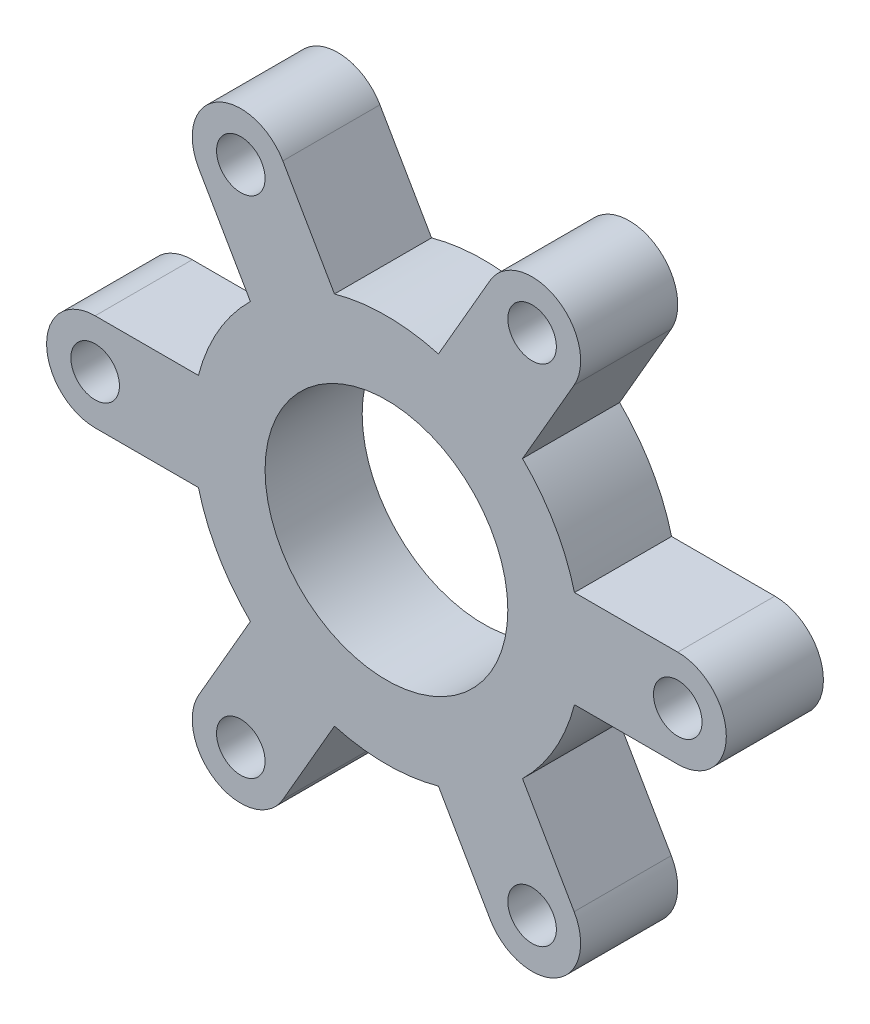
ISO-10303-21;
HEADER;
FILE_DESCRIPTION(('STEP AP214'),'2;1');
FILE_NAME('part.step','',(''),(''),'','','');
FILE_SCHEMA(('AUTOMOTIVE_DESIGN { 1 0 10303 214 1 1 1 1 }'));
ENDSEC;
DATA;
#1=APPLICATION_CONTEXT('core data for automotive mechanical design processes');
#2=APPLICATION_PROTOCOL_DEFINITION('international standard','automotive_design',2000,#1);
#3=PRODUCT_CONTEXT('',#1,'mechanical');
#4=PRODUCT('Part','Part','',(#3));
#5=PRODUCT_RELATED_PRODUCT_CATEGORY('part','',(#4));
#6=PRODUCT_DEFINITION_FORMATION('','',#4);
#7=PRODUCT_DEFINITION_CONTEXT('part definition',#1,'design');
#8=PRODUCT_DEFINITION('design','',#6,#7);
#9=PRODUCT_DEFINITION_SHAPE('','',#8);
#10=(LENGTH_UNIT() NAMED_UNIT(*) SI_UNIT(.MILLI.,.METRE.));
#11=(NAMED_UNIT(*) PLANE_ANGLE_UNIT() SI_UNIT($,.RADIAN.));
#12=(NAMED_UNIT(*) SI_UNIT($,.STERADIAN.) SOLID_ANGLE_UNIT());
#13=UNCERTAINTY_MEASURE_WITH_UNIT(LENGTH_MEASURE(1.E-05),#10,'distance_accuracy_value','');
#14=(GEOMETRIC_REPRESENTATION_CONTEXT(3) GLOBAL_UNCERTAINTY_ASSIGNED_CONTEXT((#13)) GLOBAL_UNIT_ASSIGNED_CONTEXT((#10,
#11,#12)) REPRESENTATION_CONTEXT('',''));
#15=CARTESIAN_POINT('',(0.,0.,0.));
#16=DIRECTION('',(0.,0.,1.));
#17=DIRECTION('',(1.,0.,0.));
#18=AXIS2_PLACEMENT_3D('',#15,#16,#17);
#19=CARTESIAN_POINT('',(-60.,0.,20.));
#20=DIRECTION('',(0.,0.,1.));
#21=DIRECTION('',(1.,0.,0.));
#22=AXIS2_PLACEMENT_3D('',#19,#20,#21);
#23=PLANE('',#22);
#24=CARTESIAN_POINT('',(29.9999999999995,-51.9615242270666,20.));
#25=DIRECTION('',(0.,0.,1.));
#26=DIRECTION('',(1.,0.,0.));
#27=AXIS2_PLACEMENT_3D('',#24,#25,#26);
#28=CIRCLE('',#27,5.);
#29=CARTESIAN_POINT('',(34.9999999999995,-51.9615242270666,20.));
#30=VERTEX_POINT('',#29);
#31=EDGE_CURVE('E540',#30,#30,#28,.T.);
#32=ORIENTED_EDGE('',*,*,#31,.F.);
#33=EDGE_LOOP('',(#32));
#34=FACE_BOUND('',#33,.T.);
#35=CARTESIAN_POINT('',(30.0000000000002,51.9615242270662,20.));
#36=DIRECTION('',(0.,0.,1.));
#37=DIRECTION('',(1.,0.,0.));
#38=AXIS2_PLACEMENT_3D('',#35,#36,#37);
#39=CIRCLE('',#38,5.);
#40=CARTESIAN_POINT('',(35.0000000000002,51.9615242270662,20.));
#41=VERTEX_POINT('',#40);
#42=EDGE_CURVE('E556',#41,#41,#39,.T.);
#43=ORIENTED_EDGE('',*,*,#42,.F.);
#44=EDGE_LOOP('',(#43));
#45=FACE_BOUND('',#44,.T.);
#46=CARTESIAN_POINT('',(-60.,0.,20.));
#47=DIRECTION('',(0.,0.,1.));
#48=DIRECTION('',(1.,0.,0.));
#49=AXIS2_PLACEMENT_3D('',#46,#47,#48);
#50=CIRCLE('',#49,5.);
#51=CARTESIAN_POINT('',(-55.,0.,20.));
#52=VERTEX_POINT('',#51);
#53=EDGE_CURVE('E572',#52,#52,#50,.T.);
#54=ORIENTED_EDGE('',*,*,#53,.F.);
#55=EDGE_LOOP('',(#54));
#56=FACE_BOUND('',#55,.T.);
#57=CARTESIAN_POINT('',(-60.,0.,20.));
#58=DIRECTION('',(0.,0.,1.));
#59=DIRECTION('',(1.,0.,0.));
#60=AXIS2_PLACEMENT_3D('',#57,#58,#59);
#61=CIRCLE('',#60,10.);
#62=CARTESIAN_POINT('',(-60.,10.,20.));
#63=VERTEX_POINT('',#62);
#64=CARTESIAN_POINT('',(-60.,-10.,20.));
#65=VERTEX_POINT('',#64);
#66=EDGE_CURVE('E312',#63,#65,#61,.T.);
#67=ORIENTED_EDGE('',*,*,#66,.T.);
#68=DIRECTION('',(1.,0.,0.));
#69=VECTOR('',#68,1.);
#70=CARTESIAN_POINT('',(-60.,-10.,20.));
#71=LINE('',#70,#69);
#72=CARTESIAN_POINT('',(-38.7298334620742,-9.99999999999999,20.));
#73=VERTEX_POINT('',#72);
#74=EDGE_CURVE('E152',#65,#73,#71,.T.);
#75=ORIENTED_EDGE('',*,*,#74,.T.);
#76=CARTESIAN_POINT('',(0.,0.,20.));
#77=DIRECTION('',(0.,0.,1.));
#78=DIRECTION('',(1.,0.,0.));
#79=AXIS2_PLACEMENT_3D('',#76,#77,#78);
#80=CIRCLE('',#79,40.);
#81=CARTESIAN_POINT('',(-28.0251707688818,-28.5410196624965,20.));
#82=VERTEX_POINT('',#81);
#83=EDGE_CURVE('E397',#73,#82,#80,.T.);
#84=ORIENTED_EDGE('',*,*,#83,.T.);
#85=DIRECTION('',(-0.50000000000001,-0.866025403784433,0.));
#86=VECTOR('',#85,1.);
#87=CARTESIAN_POINT('',(-38.6602540378449,-46.9615242270659,20.));
#88=LINE('',#87,#86);
#89=CARTESIAN_POINT('',(-38.6602540378449,-46.9615242270659,20.));
#90=VERTEX_POINT('',#89);
#91=EDGE_CURVE('E417',#82,#90,#88,.T.);
#92=ORIENTED_EDGE('',*,*,#91,.T.);
#93=CARTESIAN_POINT('',(-30.0000000000006,-51.961524227066,20.));
#94=DIRECTION('',(0.,0.,1.));
#95=DIRECTION('',(1.,0.,0.));
#96=AXIS2_PLACEMENT_3D('',#93,#94,#95);
#97=CIRCLE('',#96,10.);
#98=CARTESIAN_POINT('',(-21.3397459621563,-56.9615242270661,20.));
#99=VERTEX_POINT('',#98);
#100=EDGE_CURVE('E413',#90,#99,#97,.T.);
#101=ORIENTED_EDGE('',*,*,#100,.T.);
#102=DIRECTION('',(0.50000000000001,0.866025403784433,0.));
#103=VECTOR('',#102,1.);
#104=CARTESIAN_POINT('',(-21.3397459621563,-56.9615242270661,20.));
#105=LINE('',#104,#103);
#106=CARTESIAN_POINT('',(-10.7046626931932,-38.5410196624967,20.));
#107=VERTEX_POINT('',#106);
#108=EDGE_CURVE('E416',#99,#107,#105,.T.);
#109=ORIENTED_EDGE('',*,*,#108,.T.);
#110=CARTESIAN_POINT('',(0.,0.,20.));
#111=DIRECTION('',(0.,0.,1.));
#112=DIRECTION('',(1.,0.,0.));
#113=AXIS2_PLACEMENT_3D('',#110,#111,#112);
#114=CIRCLE('',#113,40.);
#115=CARTESIAN_POINT('',(10.7046626931923,-38.5410196624969,20.));
#116=VERTEX_POINT('',#115);
#117=EDGE_CURVE('E421',#107,#116,#114,.T.);
#118=ORIENTED_EDGE('',*,*,#117,.T.);
#119=DIRECTION('',(0.499999999999992,-0.866025403784443,0.));
#120=VECTOR('',#119,1.);
#121=CARTESIAN_POINT('',(21.3397459621551,-56.9615242270665,20.));
#122=LINE('',#121,#120);
#123=CARTESIAN_POINT('',(21.3397459621551,-56.9615242270665,20.));
#124=VERTEX_POINT('',#123);
#125=EDGE_CURVE('E428',#116,#124,#122,.T.);
#126=ORIENTED_EDGE('',*,*,#125,.T.);
#127=CARTESIAN_POINT('',(29.9999999999995,-51.9615242270666,20.));
#128=DIRECTION('',(0.,0.,1.));
#129=DIRECTION('',(1.,0.,0.));
#130=AXIS2_PLACEMENT_3D('',#127,#128,#129);
#131=CIRCLE('',#130,10.);
#132=CARTESIAN_POINT('',(38.6602540378439,-46.9615242270667,20.));
#133=VERTEX_POINT('',#132);
#134=EDGE_CURVE('E431',#124,#133,#131,.T.);
#135=ORIENTED_EDGE('',*,*,#134,.T.);
#136=DIRECTION('',(-0.499999999999992,0.866025403784443,0.));
#137=VECTOR('',#136,1.);
#138=CARTESIAN_POINT('',(38.6602540378439,-46.9615242270667,20.));
#139=LINE('',#138,#137);
#140=CARTESIAN_POINT('',(28.0251707688812,-28.5410196624971,20.));
#141=VERTEX_POINT('',#140);
#142=EDGE_CURVE('E434',#133,#141,#139,.T.);
#143=ORIENTED_EDGE('',*,*,#142,.T.);
#144=CARTESIAN_POINT('',(0.,0.,20.));
#145=DIRECTION('',(0.,0.,1.));
#146=DIRECTION('',(1.,0.,0.));
#147=AXIS2_PLACEMENT_3D('',#144,#145,#146);
#148=CIRCLE('',#147,40.);
#149=CARTESIAN_POINT('',(38.7298334620741,-10.0000000000003,20.));
#150=VERTEX_POINT('',#149);
#151=EDGE_CURVE('E437',#141,#150,#148,.T.);
#152=ORIENTED_EDGE('',*,*,#151,.T.);
#153=DIRECTION('',(1.,0.,0.));
#154=VECTOR('',#153,1.);
#155=CARTESIAN_POINT('',(59.9999999999999,-10.0000000000004,20.));
#156=LINE('',#155,#154);
#157=CARTESIAN_POINT('',(59.9999999999999,-10.0000000000004,20.));
#158=VERTEX_POINT('',#157);
#159=EDGE_CURVE('E440',#150,#158,#156,.T.);
#160=ORIENTED_EDGE('',*,*,#159,.T.);
#161=CARTESIAN_POINT('',(60.,-4.18977760661176E-13,20.));
#162=DIRECTION('',(0.,0.,1.));
#163=DIRECTION('',(1.,0.,0.));
#164=AXIS2_PLACEMENT_3D('',#161,#162,#163);
#165=CIRCLE('',#164,10.);
#166=CARTESIAN_POINT('',(60.0000000000001,9.99999999999958,20.));
#167=VERTEX_POINT('',#166);
#168=EDGE_CURVE('E443',#158,#167,#165,.T.);
#169=ORIENTED_EDGE('',*,*,#168,.T.);
#170=DIRECTION('',(-1.,0.,0.));
#171=VECTOR('',#170,1.);
#172=CARTESIAN_POINT('',(60.0000000000001,9.99999999999958,20.));
#173=LINE('',#172,#171);
#174=CARTESIAN_POINT('',(38.7298334620742,9.99999999999973,20.));
#175=VERTEX_POINT('',#174);
#176=EDGE_CURVE('E446',#167,#175,#173,.T.);
#177=ORIENTED_EDGE('',*,*,#176,.T.);
#178=CARTESIAN_POINT('',(0.,0.,20.));
#179=DIRECTION('',(0.,0.,1.));
#180=DIRECTION('',(1.,0.,0.));
#181=AXIS2_PLACEMENT_3D('',#178,#179,#180);
#182=CIRCLE('',#181,40.);
#183=CARTESIAN_POINT('',(28.0251707688816,28.5410196624967,20.));
#184=VERTEX_POINT('',#183);
#185=EDGE_CURVE('E449',#175,#184,#182,.T.);
#186=ORIENTED_EDGE('',*,*,#185,.T.);
#187=DIRECTION('',(0.500000000000004,0.866025403784436,0.));
#188=VECTOR('',#187,1.);
#189=CARTESIAN_POINT('',(38.6602540378446,46.9615242270661,20.));
#190=LINE('',#189,#188);
#191=CARTESIAN_POINT('',(38.6602540378446,46.9615242270661,20.));
#192=VERTEX_POINT('',#191);
#193=EDGE_CURVE('E452',#184,#192,#190,.T.);
#194=ORIENTED_EDGE('',*,*,#193,.T.);
#195=CARTESIAN_POINT('',(30.0000000000002,51.9615242270662,20.));
#196=DIRECTION('',(0.,0.,1.));
#197=DIRECTION('',(1.,0.,0.));
#198=AXIS2_PLACEMENT_3D('',#195,#196,#197);
#199=CIRCLE('',#198,10.);
#200=CARTESIAN_POINT('',(21.3397459621559,56.9615242270662,20.));
#201=VERTEX_POINT('',#200);
#202=EDGE_CURVE('E455',#192,#201,#199,.T.);
#203=ORIENTED_EDGE('',*,*,#202,.T.);
#204=DIRECTION('',(-0.500000000000004,-0.866025403784436,0.));
#205=VECTOR('',#204,1.);
#206=CARTESIAN_POINT('',(21.3397459621559,56.9615242270662,20.));
#207=LINE('',#206,#205);
#208=CARTESIAN_POINT('',(10.7046626931929,38.5410196624968,20.));
#209=VERTEX_POINT('',#208);
#210=EDGE_CURVE('E458',#201,#209,#207,.T.);
#211=ORIENTED_EDGE('',*,*,#210,.T.);
#212=CARTESIAN_POINT('',(0.,0.,20.));
#213=DIRECTION('',(0.,0.,1.));
#214=DIRECTION('',(1.,0.,0.));
#215=AXIS2_PLACEMENT_3D('',#212,#213,#214);
#216=CIRCLE('',#215,40.);
#217=CARTESIAN_POINT('',(-10.7046626931926,38.5410196624969,20.));
#218=VERTEX_POINT('',#217);
#219=EDGE_CURVE('E461',#209,#218,#216,.T.);
#220=ORIENTED_EDGE('',*,*,#219,.T.);
#221=DIRECTION('',(-0.499999999999998,0.86602540378444,0.));
#222=VECTOR('',#221,1.);
#223=CARTESIAN_POINT('',(-21.3397459621555,56.9615242270664,20.));
#224=LINE('',#223,#222);
#225=CARTESIAN_POINT('',(-21.3397459621555,56.9615242270664,20.));
#226=VERTEX_POINT('',#225);
#227=EDGE_CURVE('E464',#218,#226,#224,.T.);
#228=ORIENTED_EDGE('',*,*,#227,.T.);
#229=CARTESIAN_POINT('',(-29.9999999999999,51.9615242270664,20.));
#230=DIRECTION('',(0.,0.,1.));
#231=DIRECTION('',(1.,0.,0.));
#232=AXIS2_PLACEMENT_3D('',#229,#230,#231);
#233=CIRCLE('',#232,10.);
#234=CARTESIAN_POINT('',(-38.6602540378443,46.9615242270664,20.));
#235=VERTEX_POINT('',#234);
#236=EDGE_CURVE('E219',#226,#235,#233,.T.);
#237=ORIENTED_EDGE('',*,*,#236,.T.);
#238=DIRECTION('',(0.499999999999998,-0.86602540378444,0.));
#239=VECTOR('',#238,1.);
#240=CARTESIAN_POINT('',(-38.6602540378443,46.9615242270664,20.));
#241=LINE('',#240,#239);
#242=CARTESIAN_POINT('',(-28.0251707688814,28.5410196624969,20.));
#243=VERTEX_POINT('',#242);
#244=EDGE_CURVE('E213',#235,#243,#241,.T.);
#245=ORIENTED_EDGE('',*,*,#244,.T.);
#246=CARTESIAN_POINT('',(0.,0.,20.));
#247=DIRECTION('',(0.,0.,1.));
#248=DIRECTION('',(1.,0.,0.));
#249=AXIS2_PLACEMENT_3D('',#246,#247,#248);
#250=CIRCLE('',#249,40.);
#251=CARTESIAN_POINT('',(-38.7298334620742,10.,20.));
#252=VERTEX_POINT('',#251);
#253=EDGE_CURVE('E217',#243,#252,#250,.T.);
#254=ORIENTED_EDGE('',*,*,#253,.T.);
#255=DIRECTION('',(-1.,0.,0.));
#256=VECTOR('',#255,1.);
#257=CARTESIAN_POINT('',(-60.,10.,20.));
#258=LINE('',#257,#256);
#259=EDGE_CURVE('E61',#252,#63,#258,.T.);
#260=ORIENTED_EDGE('',*,*,#259,.T.);
#261=EDGE_LOOP('',(#67,#75,#84,#92,#101,#109,#118,#126,#135,#143,#152,#160,#169,#177,#186,#194,
#203,#211,#220,#228,#237,#245,#254,#260));
#262=FACE_BOUND('',#261,.T.);
#263=CARTESIAN_POINT('',(0.,0.,20.));
#264=DIRECTION('',(0.,0.,1.));
#265=DIRECTION('',(1.,0.,0.));
#266=AXIS2_PLACEMENT_3D('',#263,#264,#265);
#267=CIRCLE('',#266,25.);
#268=CARTESIAN_POINT('',(25.,0.,20.));
#269=VERTEX_POINT('',#268);
#270=EDGE_CURVE('E246',#269,#269,#267,.T.);
#271=ORIENTED_EDGE('',*,*,#270,.F.);
#272=EDGE_LOOP('',(#271));
#273=FACE_BOUND('',#272,.T.);
#274=CARTESIAN_POINT('',(-29.9999999999999,51.9615242270664,20.));
#275=DIRECTION('',(0.,0.,1.));
#276=DIRECTION('',(1.,0.,0.));
#277=AXIS2_PLACEMENT_3D('',#274,#275,#276);
#278=CIRCLE('',#277,5.);
#279=CARTESIAN_POINT('',(-24.9999999999999,51.9615242270664,20.));
#280=VERTEX_POINT('',#279);
#281=EDGE_CURVE('E564',#280,#280,#278,.T.);
#282=ORIENTED_EDGE('',*,*,#281,.F.);
#283=EDGE_LOOP('',(#282));
#284=FACE_BOUND('',#283,.T.);
#285=CARTESIAN_POINT('',(60.,-4.18977760661176E-13,20.));
#286=DIRECTION('',(0.,0.,1.));
#287=DIRECTION('',(1.,0.,0.));
#288=AXIS2_PLACEMENT_3D('',#285,#286,#287);
#289=CIRCLE('',#288,4.99999999999999);
#290=CARTESIAN_POINT('',(65.,-4.18977760661176E-13,20.));
#291=VERTEX_POINT('',#290);
#292=EDGE_CURVE('E548',#291,#291,#289,.T.);
#293=ORIENTED_EDGE('',*,*,#292,.F.);
#294=EDGE_LOOP('',(#293));
#295=FACE_BOUND('',#294,.T.);
#296=CARTESIAN_POINT('',(-30.0000000000006,-51.961524227066,20.));
#297=DIRECTION('',(0.,0.,1.));
#298=DIRECTION('',(1.,0.,0.));
#299=AXIS2_PLACEMENT_3D('',#296,#297,#298);
#300=CIRCLE('',#299,5.);
#301=CARTESIAN_POINT('',(-25.0000000000006,-51.961524227066,20.));
#302=VERTEX_POINT('',#301);
#303=EDGE_CURVE('E529',#302,#302,#300,.T.);
#304=ORIENTED_EDGE('',*,*,#303,.F.);
#305=EDGE_LOOP('',(#304));
#306=FACE_BOUND('',#305,.T.);
#307=ADVANCED_FACE('F43',(#34,#45,#56,#262,#273,#284,#295,#306),#23,.T.);
#308=CARTESIAN_POINT('',(-60.,0.,0.));
#309=DIRECTION('',(0.,0.,1.));
#310=DIRECTION('',(1.,0.,0.));
#311=AXIS2_PLACEMENT_3D('',#308,#309,#310);
#312=PLANE('',#311);
#313=CARTESIAN_POINT('',(-60.,0.,0.));
#314=DIRECTION('',(0.,0.,1.));
#315=DIRECTION('',(1.,0.,0.));
#316=AXIS2_PLACEMENT_3D('',#313,#314,#315);
#317=CIRCLE('',#316,10.);
#318=CARTESIAN_POINT('',(-60.,10.,0.));
#319=VERTEX_POINT('',#318);
#320=CARTESIAN_POINT('',(-60.,-10.,0.));
#321=VERTEX_POINT('',#320);
#322=EDGE_CURVE('E241',#319,#321,#317,.T.);
#323=ORIENTED_EDGE('',*,*,#322,.F.);
#324=DIRECTION('',(-1.,0.,0.));
#325=VECTOR('',#324,1.);
#326=CARTESIAN_POINT('',(-60.,10.,0.));
#327=LINE('',#326,#325);
#328=CARTESIAN_POINT('',(-38.7298334620742,10.,0.));
#329=VERTEX_POINT('',#328);
#330=EDGE_CURVE('E144',#329,#319,#327,.T.);
#331=ORIENTED_EDGE('',*,*,#330,.F.);
#332=CARTESIAN_POINT('',(0.,0.,0.));
#333=DIRECTION('',(0.,0.,1.));
#334=DIRECTION('',(1.,0.,0.));
#335=AXIS2_PLACEMENT_3D('',#332,#333,#334);
#336=CIRCLE('',#335,40.);
#337=CARTESIAN_POINT('',(-28.0251707688814,28.5410196624969,0.));
#338=VERTEX_POINT('',#337);
#339=EDGE_CURVE('E138',#338,#329,#336,.T.);
#340=ORIENTED_EDGE('',*,*,#339,.F.);
#341=DIRECTION('',(0.499999999999998,-0.86602540378444,0.));
#342=VECTOR('',#341,1.);
#343=CARTESIAN_POINT('',(-38.6602540378443,46.9615242270664,0.));
#344=LINE('',#343,#342);
#345=CARTESIAN_POINT('',(-38.6602540378443,46.9615242270664,0.));
#346=VERTEX_POINT('',#345);
#347=EDGE_CURVE('E228',#346,#338,#344,.T.);
#348=ORIENTED_EDGE('',*,*,#347,.F.);
#349=CARTESIAN_POINT('',(-29.9999999999999,51.9615242270664,0.));
#350=DIRECTION('',(0.,0.,1.));
#351=DIRECTION('',(1.,0.,0.));
#352=AXIS2_PLACEMENT_3D('',#349,#350,#351);
#353=CIRCLE('',#352,10.);
#354=CARTESIAN_POINT('',(-21.3397459621555,56.9615242270664,0.));
#355=VERTEX_POINT('',#354);
#356=EDGE_CURVE('E303',#355,#346,#353,.T.);
#357=ORIENTED_EDGE('',*,*,#356,.F.);
#358=DIRECTION('',(-0.499999999999998,0.86602540378444,0.));
#359=VECTOR('',#358,1.);
#360=CARTESIAN_POINT('',(-21.3397459621555,56.9615242270664,0.));
#361=LINE('',#360,#359);
#362=CARTESIAN_POINT('',(-10.7046626931926,38.5410196624969,0.));
#363=VERTEX_POINT('',#362);
#364=EDGE_CURVE('E300',#363,#355,#361,.T.);
#365=ORIENTED_EDGE('',*,*,#364,.F.);
#366=CARTESIAN_POINT('',(0.,0.,0.));
#367=DIRECTION('',(0.,0.,1.));
#368=DIRECTION('',(1.,0.,0.));
#369=AXIS2_PLACEMENT_3D('',#366,#367,#368);
#370=CIRCLE('',#369,40.);
#371=CARTESIAN_POINT('',(10.7046626931929,38.5410196624968,0.));
#372=VERTEX_POINT('',#371);
#373=EDGE_CURVE('E297',#372,#363,#370,.T.);
#374=ORIENTED_EDGE('',*,*,#373,.F.);
#375=DIRECTION('',(-0.500000000000004,-0.866025403784436,0.));
#376=VECTOR('',#375,1.);
#377=CARTESIAN_POINT('',(21.3397459621559,56.9615242270662,0.));
#378=LINE('',#377,#376);
#379=CARTESIAN_POINT('',(21.3397459621559,56.9615242270662,0.));
#380=VERTEX_POINT('',#379);
#381=EDGE_CURVE('E294',#380,#372,#378,.T.);
#382=ORIENTED_EDGE('',*,*,#381,.F.);
#383=CARTESIAN_POINT('',(30.0000000000002,51.9615242270662,0.));
#384=DIRECTION('',(0.,0.,1.));
#385=DIRECTION('',(1.,0.,0.));
#386=AXIS2_PLACEMENT_3D('',#383,#384,#385);
#387=CIRCLE('',#386,10.);
#388=CARTESIAN_POINT('',(38.6602540378446,46.9615242270661,0.));
#389=VERTEX_POINT('',#388);
#390=EDGE_CURVE('E291',#389,#380,#387,.T.);
#391=ORIENTED_EDGE('',*,*,#390,.F.);
#392=DIRECTION('',(0.500000000000004,0.866025403784436,0.));
#393=VECTOR('',#392,1.);
#394=CARTESIAN_POINT('',(38.6602540378446,46.9615242270661,0.));
#395=LINE('',#394,#393);
#396=CARTESIAN_POINT('',(28.0251707688816,28.5410196624967,0.));
#397=VERTEX_POINT('',#396);
#398=EDGE_CURVE('E288',#397,#389,#395,.T.);
#399=ORIENTED_EDGE('',*,*,#398,.F.);
#400=CARTESIAN_POINT('',(0.,0.,0.));
#401=DIRECTION('',(0.,0.,1.));
#402=DIRECTION('',(1.,0.,0.));
#403=AXIS2_PLACEMENT_3D('',#400,#401,#402);
#404=CIRCLE('',#403,40.);
#405=CARTESIAN_POINT('',(38.7298334620742,9.99999999999973,0.));
#406=VERTEX_POINT('',#405);
#407=EDGE_CURVE('E285',#406,#397,#404,.T.);
#408=ORIENTED_EDGE('',*,*,#407,.F.);
#409=DIRECTION('',(-1.,0.,0.));
#410=VECTOR('',#409,1.);
#411=CARTESIAN_POINT('',(60.0000000000001,9.99999999999958,0.));
#412=LINE('',#411,#410);
#413=CARTESIAN_POINT('',(60.0000000000001,9.99999999999958,0.));
#414=VERTEX_POINT('',#413);
#415=EDGE_CURVE('E282',#414,#406,#412,.T.);
#416=ORIENTED_EDGE('',*,*,#415,.F.);
#417=CARTESIAN_POINT('',(60.,-4.18977760661176E-13,0.));
#418=DIRECTION('',(0.,0.,1.));
#419=DIRECTION('',(1.,0.,0.));
#420=AXIS2_PLACEMENT_3D('',#417,#418,#419);
#421=CIRCLE('',#420,10.);
#422=CARTESIAN_POINT('',(59.9999999999999,-10.0000000000004,0.));
#423=VERTEX_POINT('',#422);
#424=EDGE_CURVE('E279',#423,#414,#421,.T.);
#425=ORIENTED_EDGE('',*,*,#424,.F.);
#426=DIRECTION('',(1.,0.,0.));
#427=VECTOR('',#426,1.);
#428=CARTESIAN_POINT('',(59.9999999999999,-10.0000000000004,0.));
#429=LINE('',#428,#427);
#430=CARTESIAN_POINT('',(38.7298334620741,-10.0000000000003,0.));
#431=VERTEX_POINT('',#430);
#432=EDGE_CURVE('E276',#431,#423,#429,.T.);
#433=ORIENTED_EDGE('',*,*,#432,.F.);
#434=CARTESIAN_POINT('',(0.,0.,0.));
#435=DIRECTION('',(0.,0.,1.));
#436=DIRECTION('',(1.,0.,0.));
#437=AXIS2_PLACEMENT_3D('',#434,#435,#436);
#438=CIRCLE('',#437,40.);
#439=CARTESIAN_POINT('',(28.0251707688812,-28.5410196624971,0.));
#440=VERTEX_POINT('',#439);
#441=EDGE_CURVE('E273',#440,#431,#438,.T.);
#442=ORIENTED_EDGE('',*,*,#441,.F.);
#443=DIRECTION('',(-0.499999999999992,0.866025403784443,0.));
#444=VECTOR('',#443,1.);
#445=CARTESIAN_POINT('',(38.6602540378439,-46.9615242270667,0.));
#446=LINE('',#445,#444);
#447=CARTESIAN_POINT('',(38.6602540378439,-46.9615242270667,0.));
#448=VERTEX_POINT('',#447);
#449=EDGE_CURVE('E270',#448,#440,#446,.T.);
#450=ORIENTED_EDGE('',*,*,#449,.F.);
#451=CARTESIAN_POINT('',(29.9999999999995,-51.9615242270666,0.));
#452=DIRECTION('',(0.,0.,1.));
#453=DIRECTION('',(1.,0.,0.));
#454=AXIS2_PLACEMENT_3D('',#451,#452,#453);
#455=CIRCLE('',#454,10.);
#456=CARTESIAN_POINT('',(21.3397459621551,-56.9615242270665,0.));
#457=VERTEX_POINT('',#456);
#458=EDGE_CURVE('E267',#457,#448,#455,.T.);
#459=ORIENTED_EDGE('',*,*,#458,.F.);
#460=DIRECTION('',(0.499999999999992,-0.866025403784443,0.));
#461=VECTOR('',#460,1.);
#462=CARTESIAN_POINT('',(21.3397459621551,-56.9615242270665,0.));
#463=LINE('',#462,#461);
#464=CARTESIAN_POINT('',(10.7046626931923,-38.5410196624969,0.));
#465=VERTEX_POINT('',#464);
#466=EDGE_CURVE('E264',#465,#457,#463,.T.);
#467=ORIENTED_EDGE('',*,*,#466,.F.);
#468=CARTESIAN_POINT('',(0.,0.,0.));
#469=DIRECTION('',(0.,0.,1.));
#470=DIRECTION('',(1.,0.,0.));
#471=AXIS2_PLACEMENT_3D('',#468,#469,#470);
#472=CIRCLE('',#471,40.);
#473=CARTESIAN_POINT('',(-10.7046626931932,-38.5410196624967,0.));
#474=VERTEX_POINT('',#473);
#475=EDGE_CURVE('E261',#474,#465,#472,.T.);
#476=ORIENTED_EDGE('',*,*,#475,.F.);
#477=DIRECTION('',(0.50000000000001,0.866025403784433,0.));
#478=VECTOR('',#477,1.);
#479=CARTESIAN_POINT('',(-21.3397459621563,-56.9615242270661,0.));
#480=LINE('',#479,#478);
#481=CARTESIAN_POINT('',(-21.3397459621563,-56.9615242270661,0.));
#482=VERTEX_POINT('',#481);
#483=EDGE_CURVE('E258',#482,#474,#480,.T.);
#484=ORIENTED_EDGE('',*,*,#483,.F.);
#485=CARTESIAN_POINT('',(-30.0000000000006,-51.961524227066,0.));
#486=DIRECTION('',(0.,0.,1.));
#487=DIRECTION('',(1.,0.,0.));
#488=AXIS2_PLACEMENT_3D('',#485,#486,#487);
#489=CIRCLE('',#488,10.);
#490=CARTESIAN_POINT('',(-38.6602540378449,-46.9615242270659,0.));
#491=VERTEX_POINT('',#490);
#492=EDGE_CURVE('E255',#491,#482,#489,.T.);
#493=ORIENTED_EDGE('',*,*,#492,.F.);
#494=DIRECTION('',(-0.50000000000001,-0.866025403784433,0.));
#495=VECTOR('',#494,1.);
#496=CARTESIAN_POINT('',(-38.6602540378449,-46.9615242270659,0.));
#497=LINE('',#496,#495);
#498=CARTESIAN_POINT('',(-28.0251707688818,-28.5410196624965,0.));
#499=VERTEX_POINT('',#498);
#500=EDGE_CURVE('E252',#499,#491,#497,.T.);
#501=ORIENTED_EDGE('',*,*,#500,.F.);
#502=CARTESIAN_POINT('',(0.,0.,0.));
#503=DIRECTION('',(0.,0.,1.));
#504=DIRECTION('',(1.,0.,0.));
#505=AXIS2_PLACEMENT_3D('',#502,#503,#504);
#506=CIRCLE('',#505,40.);
#507=CARTESIAN_POINT('',(-38.7298334620742,-9.99999999999999,0.));
#508=VERTEX_POINT('',#507);
#509=EDGE_CURVE('E249',#508,#499,#506,.T.);
#510=ORIENTED_EDGE('',*,*,#509,.F.);
#511=DIRECTION('',(1.,0.,0.));
#512=VECTOR('',#511,1.);
#513=CARTESIAN_POINT('',(-60.,-10.,0.));
#514=LINE('',#513,#512);
#515=EDGE_CURVE('E245',#321,#508,#514,.T.);
#516=ORIENTED_EDGE('',*,*,#515,.F.);
#517=EDGE_LOOP('',(#323,#331,#340,#348,#357,#365,#374,#382,#391,#399,#408,#416,#425,#433,#442,
#450,#459,#467,#476,#484,#493,#501,#510,#516));
#518=FACE_BOUND('',#517,.T.);
#519=CARTESIAN_POINT('',(0.,0.,0.));
#520=DIRECTION('',(0.,0.,1.));
#521=DIRECTION('',(1.,0.,0.));
#522=AXIS2_PLACEMENT_3D('',#519,#520,#521);
#523=CIRCLE('',#522,25.);
#524=CARTESIAN_POINT('',(25.,0.,0.));
#525=VERTEX_POINT('',#524);
#526=EDGE_CURVE('E576',#525,#525,#523,.T.);
#527=ORIENTED_EDGE('',*,*,#526,.T.);
#528=EDGE_LOOP('',(#527));
#529=FACE_BOUND('',#528,.T.);
#530=CARTESIAN_POINT('',(-60.,0.,0.));
#531=DIRECTION('',(0.,0.,1.));
#532=DIRECTION('',(1.,0.,0.));
#533=AXIS2_PLACEMENT_3D('',#530,#531,#532);
#534=CIRCLE('',#533,5.);
#535=CARTESIAN_POINT('',(-55.,0.,0.));
#536=VERTEX_POINT('',#535);
#537=EDGE_CURVE('E568',#536,#536,#534,.T.);
#538=ORIENTED_EDGE('',*,*,#537,.T.);
#539=EDGE_LOOP('',(#538));
#540=FACE_BOUND('',#539,.T.);
#541=CARTESIAN_POINT('',(-29.9999999999999,51.9615242270664,0.));
#542=DIRECTION('',(0.,0.,1.));
#543=DIRECTION('',(1.,0.,0.));
#544=AXIS2_PLACEMENT_3D('',#541,#542,#543);
#545=CIRCLE('',#544,5.);
#546=CARTESIAN_POINT('',(-24.9999999999999,51.9615242270664,0.));
#547=VERTEX_POINT('',#546);
#548=EDGE_CURVE('E560',#547,#547,#545,.T.);
#549=ORIENTED_EDGE('',*,*,#548,.T.);
#550=EDGE_LOOP('',(#549));
#551=FACE_BOUND('',#550,.T.);
#552=CARTESIAN_POINT('',(30.0000000000002,51.9615242270662,0.));
#553=DIRECTION('',(0.,0.,1.));
#554=DIRECTION('',(1.,0.,0.));
#555=AXIS2_PLACEMENT_3D('',#552,#553,#554);
#556=CIRCLE('',#555,5.);
#557=CARTESIAN_POINT('',(35.0000000000002,51.9615242270662,0.));
#558=VERTEX_POINT('',#557);
#559=EDGE_CURVE('E552',#558,#558,#556,.T.);
#560=ORIENTED_EDGE('',*,*,#559,.T.);
#561=EDGE_LOOP('',(#560));
#562=FACE_BOUND('',#561,.T.);
#563=CARTESIAN_POINT('',(60.,-4.18977760661176E-13,0.));
#564=DIRECTION('',(0.,0.,1.));
#565=DIRECTION('',(1.,0.,0.));
#566=AXIS2_PLACEMENT_3D('',#563,#564,#565);
#567=CIRCLE('',#566,4.99999999999999);
#568=CARTESIAN_POINT('',(65.,-4.18977760661176E-13,0.));
#569=VERTEX_POINT('',#568);
#570=EDGE_CURVE('E544',#569,#569,#567,.T.);
#571=ORIENTED_EDGE('',*,*,#570,.T.);
#572=EDGE_LOOP('',(#571));
#573=FACE_BOUND('',#572,.T.);
#574=CARTESIAN_POINT('',(29.9999999999995,-51.9615242270666,0.));
#575=DIRECTION('',(0.,0.,1.));
#576=DIRECTION('',(1.,0.,0.));
#577=AXIS2_PLACEMENT_3D('',#574,#575,#576);
#578=CIRCLE('',#577,5.);
#579=CARTESIAN_POINT('',(34.9999999999995,-51.9615242270666,0.));
#580=VERTEX_POINT('',#579);
#581=EDGE_CURVE('E537',#580,#580,#578,.T.);
#582=ORIENTED_EDGE('',*,*,#581,.T.);
#583=EDGE_LOOP('',(#582));
#584=FACE_BOUND('',#583,.T.);
#585=CARTESIAN_POINT('',(-30.0000000000006,-51.961524227066,0.));
#586=DIRECTION('',(0.,0.,1.));
#587=DIRECTION('',(1.,0.,0.));
#588=AXIS2_PLACEMENT_3D('',#585,#586,#587);
#589=CIRCLE('',#588,5.);
#590=CARTESIAN_POINT('',(-25.0000000000006,-51.961524227066,0.));
#591=VERTEX_POINT('',#590);
#592=EDGE_CURVE('E532',#591,#591,#589,.T.);
#593=ORIENTED_EDGE('',*,*,#592,.T.);
#594=EDGE_LOOP('',(#593));
#595=FACE_BOUND('',#594,.T.);
#596=ADVANCED_FACE('F401',(#518,#529,#540,#551,#562,#573,#584,#595),#312,.F.);
#597=CARTESIAN_POINT('',(-60.,0.,20.));
#598=DIRECTION('',(0.,0.,-1.));
#599=DIRECTION('',(-1.,0.,0.));
#600=AXIS2_PLACEMENT_3D('',#597,#598,#599);
#601=CYLINDRICAL_SURFACE('',#600,10.);
#602=ORIENTED_EDGE('',*,*,#322,.T.);
#603=DIRECTION('',(0.,0.,-1.));
#604=VECTOR('',#603,1.);
#605=CARTESIAN_POINT('',(-60.,-10.,20.));
#606=LINE('',#605,#604);
#607=EDGE_CURVE('E11',#65,#321,#606,.T.);
#608=ORIENTED_EDGE('',*,*,#607,.F.);
#609=ORIENTED_EDGE('',*,*,#66,.F.);
#610=DIRECTION('',(0.,0.,-1.));
#611=VECTOR('',#610,1.);
#612=CARTESIAN_POINT('',(-60.,10.,20.));
#613=LINE('',#612,#611);
#614=EDGE_CURVE('E237',#63,#319,#613,.T.);
#615=ORIENTED_EDGE('',*,*,#614,.T.);
#616=EDGE_LOOP('',(#602,#608,#609,#615));
#617=FACE_BOUND('',#616,.T.);
#618=ADVANCED_FACE('F45',(#617),#601,.T.);
#619=CARTESIAN_POINT('',(-60.,-10.,20.));
#620=DIRECTION('',(0.,1.,0.));
#621=DIRECTION('',(0.,0.,1.));
#622=AXIS2_PLACEMENT_3D('',#619,#620,#621);
#623=PLANE('',#622);
#624=ORIENTED_EDGE('',*,*,#515,.T.);
#625=DIRECTION('',(0.,0.,-1.));
#626=VECTOR('',#625,1.);
#627=CARTESIAN_POINT('',(-38.7298334620742,-9.99999999999999,20.));
#628=LINE('',#627,#626);
#629=EDGE_CURVE('E53',#73,#508,#628,.T.);
#630=ORIENTED_EDGE('',*,*,#629,.F.);
#631=ORIENTED_EDGE('',*,*,#74,.F.);
#632=ORIENTED_EDGE('',*,*,#607,.T.);
#633=EDGE_LOOP('',(#624,#630,#631,#632));
#634=FACE_BOUND('',#633,.T.);
#635=ADVANCED_FACE('F861',(#634),#623,.F.);
#636=CARTESIAN_POINT('',(0.,0.,20.));
#637=DIRECTION('',(0.,0.,-1.));
#638=DIRECTION('',(-1.,0.,0.));
#639=AXIS2_PLACEMENT_3D('',#636,#637,#638);
#640=CYLINDRICAL_SURFACE('',#639,40.);
#641=ORIENTED_EDGE('',*,*,#509,.T.);
#642=DIRECTION('',(0.,0.,-1.));
#643=VECTOR('',#642,1.);
#644=CARTESIAN_POINT('',(-28.0251707688818,-28.5410196624965,20.));
#645=LINE('',#644,#643);
#646=EDGE_CURVE('E387',#82,#499,#645,.T.);
#647=ORIENTED_EDGE('',*,*,#646,.F.);
#648=ORIENTED_EDGE('',*,*,#83,.F.);
#649=ORIENTED_EDGE('',*,*,#629,.T.);
#650=EDGE_LOOP('',(#641,#647,#648,#649));
#651=FACE_BOUND('',#650,.T.);
#652=ADVANCED_FACE('F395',(#651),#640,.T.);
#653=CARTESIAN_POINT('',(-38.6602540378449,-46.9615242270659,20.));
#654=DIRECTION('',(0.866025403784433,-0.50000000000001,0.));
#655=DIRECTION('',(0.50000000000001,0.866025403784433,0.));
#656=AXIS2_PLACEMENT_3D('',#653,#654,#655);
#657=PLANE('',#656);
#658=ORIENTED_EDGE('',*,*,#500,.T.);
#659=DIRECTION('',(0.,0.,-1.));
#660=VECTOR('',#659,1.);
#661=CARTESIAN_POINT('',(-38.6602540378449,-46.9615242270659,20.));
#662=LINE('',#661,#660);
#663=EDGE_CURVE('E383',#90,#491,#662,.T.);
#664=ORIENTED_EDGE('',*,*,#663,.F.);
#665=ORIENTED_EDGE('',*,*,#91,.F.);
#666=ORIENTED_EDGE('',*,*,#646,.T.);
#667=EDGE_LOOP('',(#658,#664,#665,#666));
#668=FACE_BOUND('',#667,.T.);
#669=ADVANCED_FACE('F407',(#668),#657,.F.);
#670=CARTESIAN_POINT('',(-30.0000000000006,-51.961524227066,20.));
#671=DIRECTION('',(0.,0.,-1.));
#672=DIRECTION('',(-1.,0.,0.));
#673=AXIS2_PLACEMENT_3D('',#670,#671,#672);
#674=CYLINDRICAL_SURFACE('',#673,10.);
#675=ORIENTED_EDGE('',*,*,#492,.T.);
#676=DIRECTION('',(0.,0.,-1.));
#677=VECTOR('',#676,1.);
#678=CARTESIAN_POINT('',(-21.3397459621563,-56.9615242270661,20.));
#679=LINE('',#678,#677);
#680=EDGE_CURVE('E379',#99,#482,#679,.T.);
#681=ORIENTED_EDGE('',*,*,#680,.F.);
#682=ORIENTED_EDGE('',*,*,#100,.F.);
#683=ORIENTED_EDGE('',*,*,#663,.T.);
#684=EDGE_LOOP('',(#675,#681,#682,#683));
#685=FACE_BOUND('',#684,.T.);
#686=ADVANCED_FACE('F411',(#685),#674,.T.);
#687=CARTESIAN_POINT('',(-21.3397459621563,-56.9615242270661,20.));
#688=DIRECTION('',(-0.866025403784433,0.50000000000001,0.));
#689=DIRECTION('',(-0.50000000000001,-0.866025403784433,0.));
#690=AXIS2_PLACEMENT_3D('',#687,#688,#689);
#691=PLANE('',#690);
#692=ORIENTED_EDGE('',*,*,#483,.T.);
#693=DIRECTION('',(0.,0.,-1.));
#694=VECTOR('',#693,1.);
#695=CARTESIAN_POINT('',(-10.7046626931932,-38.5410196624967,20.));
#696=LINE('',#695,#694);
#697=EDGE_CURVE('E375',#107,#474,#696,.T.);
#698=ORIENTED_EDGE('',*,*,#697,.F.);
#699=ORIENTED_EDGE('',*,*,#108,.F.);
#700=ORIENTED_EDGE('',*,*,#680,.T.);
#701=EDGE_LOOP('',(#692,#698,#699,#700));
#702=FACE_BOUND('',#701,.T.);
#703=ADVANCED_FACE('F822',(#702),#691,.F.);
#704=CARTESIAN_POINT('',(0.,0.,20.));
#705=DIRECTION('',(0.,0.,-1.));
#706=DIRECTION('',(-1.,0.,0.));
#707=AXIS2_PLACEMENT_3D('',#704,#705,#706);
#708=CYLINDRICAL_SURFACE('',#707,40.);
#709=ORIENTED_EDGE('',*,*,#475,.T.);
#710=DIRECTION('',(0.,0.,-1.));
#711=VECTOR('',#710,1.);
#712=CARTESIAN_POINT('',(10.7046626931923,-38.5410196624969,20.));
#713=LINE('',#712,#711);
#714=EDGE_CURVE('E371',#116,#465,#713,.T.);
#715=ORIENTED_EDGE('',*,*,#714,.F.);
#716=ORIENTED_EDGE('',*,*,#117,.F.);
#717=ORIENTED_EDGE('',*,*,#697,.T.);
#718=EDGE_LOOP('',(#709,#715,#716,#717));
#719=FACE_BOUND('',#718,.T.);
#720=ADVANCED_FACE('F811',(#719),#708,.T.);
#721=CARTESIAN_POINT('',(21.3397459621551,-56.9615242270665,20.));
#722=DIRECTION('',(0.866025403784443,0.499999999999992,0.));
#723=DIRECTION('',(-0.499999999999992,0.866025403784443,0.));
#724=AXIS2_PLACEMENT_3D('',#721,#722,#723);
#725=PLANE('',#724);
#726=ORIENTED_EDGE('',*,*,#466,.T.);
#727=DIRECTION('',(0.,0.,-1.));
#728=VECTOR('',#727,1.);
#729=CARTESIAN_POINT('',(21.3397459621551,-56.9615242270665,20.));
#730=LINE('',#729,#728);
#731=EDGE_CURVE('E367',#124,#457,#730,.T.);
#732=ORIENTED_EDGE('',*,*,#731,.F.);
#733=ORIENTED_EDGE('',*,*,#125,.F.);
#734=ORIENTED_EDGE('',*,*,#714,.T.);
#735=EDGE_LOOP('',(#726,#732,#733,#734));
#736=FACE_BOUND('',#735,.T.);
#737=ADVANCED_FACE('F800',(#736),#725,.F.);
#738=CARTESIAN_POINT('',(29.9999999999995,-51.9615242270666,20.));
#739=DIRECTION('',(0.,0.,-1.));
#740=DIRECTION('',(-1.,0.,0.));
#741=AXIS2_PLACEMENT_3D('',#738,#739,#740);
#742=CYLINDRICAL_SURFACE('',#741,10.);
#743=ORIENTED_EDGE('',*,*,#458,.T.);
#744=DIRECTION('',(0.,0.,-1.));
#745=VECTOR('',#744,1.);
#746=CARTESIAN_POINT('',(38.6602540378439,-46.9615242270667,20.));
#747=LINE('',#746,#745);
#748=EDGE_CURVE('E363',#133,#448,#747,.T.);
#749=ORIENTED_EDGE('',*,*,#748,.F.);
#750=ORIENTED_EDGE('',*,*,#134,.F.);
#751=ORIENTED_EDGE('',*,*,#731,.T.);
#752=EDGE_LOOP('',(#743,#749,#750,#751));
#753=FACE_BOUND('',#752,.T.);
#754=ADVANCED_FACE('F789',(#753),#742,.T.);
#755=CARTESIAN_POINT('',(38.6602540378439,-46.9615242270667,20.));
#756=DIRECTION('',(-0.866025403784443,-0.499999999999992,0.));
#757=DIRECTION('',(0.499999999999992,-0.866025403784443,0.));
#758=AXIS2_PLACEMENT_3D('',#755,#756,#757);
#759=PLANE('',#758);
#760=ORIENTED_EDGE('',*,*,#449,.T.);
#761=DIRECTION('',(0.,0.,-1.));
#762=VECTOR('',#761,1.);
#763=CARTESIAN_POINT('',(28.0251707688812,-28.5410196624971,20.));
#764=LINE('',#763,#762);
#765=EDGE_CURVE('E359',#141,#440,#764,.T.);
#766=ORIENTED_EDGE('',*,*,#765,.F.);
#767=ORIENTED_EDGE('',*,*,#142,.F.);
#768=ORIENTED_EDGE('',*,*,#748,.T.);
#769=EDGE_LOOP('',(#760,#766,#767,#768));
#770=FACE_BOUND('',#769,.T.);
#771=ADVANCED_FACE('F778',(#770),#759,.F.);
#772=CARTESIAN_POINT('',(0.,0.,20.));
#773=DIRECTION('',(0.,0.,-1.));
#774=DIRECTION('',(-1.,0.,0.));
#775=AXIS2_PLACEMENT_3D('',#772,#773,#774);
#776=CYLINDRICAL_SURFACE('',#775,40.);
#777=ORIENTED_EDGE('',*,*,#441,.T.);
#778=DIRECTION('',(0.,0.,-1.));
#779=VECTOR('',#778,1.);
#780=CARTESIAN_POINT('',(38.7298334620741,-10.0000000000003,20.));
#781=LINE('',#780,#779);
#782=EDGE_CURVE('E355',#150,#431,#781,.T.);
#783=ORIENTED_EDGE('',*,*,#782,.F.);
#784=ORIENTED_EDGE('',*,*,#151,.F.);
#785=ORIENTED_EDGE('',*,*,#765,.T.);
#786=EDGE_LOOP('',(#777,#783,#784,#785));
#787=FACE_BOUND('',#786,.T.);
#788=ADVANCED_FACE('F767',(#787),#776,.T.);
#789=CARTESIAN_POINT('',(59.9999999999999,-10.0000000000004,20.));
#790=DIRECTION('',(0.,1.,0.));
#791=DIRECTION('',(-1.,0.,0.));
#792=AXIS2_PLACEMENT_3D('',#789,#790,#791);
#793=PLANE('',#792);
#794=ORIENTED_EDGE('',*,*,#432,.T.);
#795=DIRECTION('',(0.,0.,-1.));
#796=VECTOR('',#795,1.);
#797=CARTESIAN_POINT('',(59.9999999999999,-10.0000000000004,20.));
#798=LINE('',#797,#796);
#799=EDGE_CURVE('E351',#158,#423,#798,.T.);
#800=ORIENTED_EDGE('',*,*,#799,.F.);
#801=ORIENTED_EDGE('',*,*,#159,.F.);
#802=ORIENTED_EDGE('',*,*,#782,.T.);
#803=EDGE_LOOP('',(#794,#800,#801,#802));
#804=FACE_BOUND('',#803,.T.);
#805=ADVANCED_FACE('F756',(#804),#793,.F.);
#806=CARTESIAN_POINT('',(60.,-4.18977760661176E-13,20.));
#807=DIRECTION('',(0.,0.,-1.));
#808=DIRECTION('',(-1.,0.,0.));
#809=AXIS2_PLACEMENT_3D('',#806,#807,#808);
#810=CYLINDRICAL_SURFACE('',#809,10.);
#811=ORIENTED_EDGE('',*,*,#424,.T.);
#812=DIRECTION('',(0.,0.,-1.));
#813=VECTOR('',#812,1.);
#814=CARTESIAN_POINT('',(60.0000000000001,9.99999999999958,20.));
#815=LINE('',#814,#813);
#816=EDGE_CURVE('E347',#167,#414,#815,.T.);
#817=ORIENTED_EDGE('',*,*,#816,.F.);
#818=ORIENTED_EDGE('',*,*,#168,.F.);
#819=ORIENTED_EDGE('',*,*,#799,.T.);
#820=EDGE_LOOP('',(#811,#817,#818,#819));
#821=FACE_BOUND('',#820,.T.);
#822=ADVANCED_FACE('F745',(#821),#810,.T.);
#823=CARTESIAN_POINT('',(60.0000000000001,9.99999999999958,20.));
#824=DIRECTION('',(0.,-1.,0.));
#825=DIRECTION('',(1.,0.,0.));
#826=AXIS2_PLACEMENT_3D('',#823,#824,#825);
#827=PLANE('',#826);
#828=ORIENTED_EDGE('',*,*,#415,.T.);
#829=DIRECTION('',(0.,0.,-1.));
#830=VECTOR('',#829,1.);
#831=CARTESIAN_POINT('',(38.7298334620742,9.99999999999973,20.));
#832=LINE('',#831,#830);
#833=EDGE_CURVE('E343',#175,#406,#832,.T.);
#834=ORIENTED_EDGE('',*,*,#833,.F.);
#835=ORIENTED_EDGE('',*,*,#176,.F.);
#836=ORIENTED_EDGE('',*,*,#816,.T.);
#837=EDGE_LOOP('',(#828,#834,#835,#836));
#838=FACE_BOUND('',#837,.T.);
#839=ADVANCED_FACE('F734',(#838),#827,.F.);
#840=CARTESIAN_POINT('',(0.,0.,20.));
#841=DIRECTION('',(0.,0.,-1.));
#842=DIRECTION('',(-1.,0.,0.));
#843=AXIS2_PLACEMENT_3D('',#840,#841,#842);
#844=CYLINDRICAL_SURFACE('',#843,40.);
#845=ORIENTED_EDGE('',*,*,#407,.T.);
#846=DIRECTION('',(0.,0.,-1.));
#847=VECTOR('',#846,1.);
#848=CARTESIAN_POINT('',(28.0251707688816,28.5410196624967,20.));
#849=LINE('',#848,#847);
#850=EDGE_CURVE('E339',#184,#397,#849,.T.);
#851=ORIENTED_EDGE('',*,*,#850,.F.);
#852=ORIENTED_EDGE('',*,*,#185,.F.);
#853=ORIENTED_EDGE('',*,*,#833,.T.);
#854=EDGE_LOOP('',(#845,#851,#852,#853));
#855=FACE_BOUND('',#854,.T.);
#856=ADVANCED_FACE('F723',(#855),#844,.T.);
#857=CARTESIAN_POINT('',(38.6602540378446,46.9615242270661,20.));
#858=DIRECTION('',(-0.866025403784436,0.500000000000004,0.));
#859=DIRECTION('',(-0.500000000000004,-0.866025403784436,0.));
#860=AXIS2_PLACEMENT_3D('',#857,#858,#859);
#861=PLANE('',#860);
#862=ORIENTED_EDGE('',*,*,#398,.T.);
#863=DIRECTION('',(0.,0.,-1.));
#864=VECTOR('',#863,1.);
#865=CARTESIAN_POINT('',(38.6602540378446,46.9615242270661,20.));
#866=LINE('',#865,#864);
#867=EDGE_CURVE('E335',#192,#389,#866,.T.);
#868=ORIENTED_EDGE('',*,*,#867,.F.);
#869=ORIENTED_EDGE('',*,*,#193,.F.);
#870=ORIENTED_EDGE('',*,*,#850,.T.);
#871=EDGE_LOOP('',(#862,#868,#869,#870));
#872=FACE_BOUND('',#871,.T.);
#873=ADVANCED_FACE('F712',(#872),#861,.F.);
#874=CARTESIAN_POINT('',(30.0000000000002,51.9615242270662,20.));
#875=DIRECTION('',(0.,0.,-1.));
#876=DIRECTION('',(-1.,0.,0.));
#877=AXIS2_PLACEMENT_3D('',#874,#875,#876);
#878=CYLINDRICAL_SURFACE('',#877,10.);
#879=ORIENTED_EDGE('',*,*,#390,.T.);
#880=DIRECTION('',(0.,0.,-1.));
#881=VECTOR('',#880,1.);
#882=CARTESIAN_POINT('',(21.3397459621559,56.9615242270662,20.));
#883=LINE('',#882,#881);
#884=EDGE_CURVE('E331',#201,#380,#883,.T.);
#885=ORIENTED_EDGE('',*,*,#884,.F.);
#886=ORIENTED_EDGE('',*,*,#202,.F.);
#887=ORIENTED_EDGE('',*,*,#867,.T.);
#888=EDGE_LOOP('',(#879,#885,#886,#887));
#889=FACE_BOUND('',#888,.T.);
#890=ADVANCED_FACE('F701',(#889),#878,.T.);
#891=CARTESIAN_POINT('',(21.3397459621559,56.9615242270662,20.));
#892=DIRECTION('',(0.866025403784436,-0.500000000000004,0.));
#893=DIRECTION('',(0.500000000000004,0.866025403784436,0.));
#894=AXIS2_PLACEMENT_3D('',#891,#892,#893);
#895=PLANE('',#894);
#896=ORIENTED_EDGE('',*,*,#381,.T.);
#897=DIRECTION('',(0.,0.,-1.));
#898=VECTOR('',#897,1.);
#899=CARTESIAN_POINT('',(10.7046626931929,38.5410196624968,20.));
#900=LINE('',#899,#898);
#901=EDGE_CURVE('E327',#209,#372,#900,.T.);
#902=ORIENTED_EDGE('',*,*,#901,.F.);
#903=ORIENTED_EDGE('',*,*,#210,.F.);
#904=ORIENTED_EDGE('',*,*,#884,.T.);
#905=EDGE_LOOP('',(#896,#902,#903,#904));
#906=FACE_BOUND('',#905,.T.);
#907=ADVANCED_FACE('F690',(#906),#895,.F.);
#908=CARTESIAN_POINT('',(0.,0.,20.));
#909=DIRECTION('',(0.,0.,-1.));
#910=DIRECTION('',(-1.,0.,0.));
#911=AXIS2_PLACEMENT_3D('',#908,#909,#910);
#912=CYLINDRICAL_SURFACE('',#911,40.);
#913=ORIENTED_EDGE('',*,*,#373,.T.);
#914=DIRECTION('',(0.,0.,-1.));
#915=VECTOR('',#914,1.);
#916=CARTESIAN_POINT('',(-10.7046626931926,38.5410196624969,20.));
#917=LINE('',#916,#915);
#918=EDGE_CURVE('E323',#218,#363,#917,.T.);
#919=ORIENTED_EDGE('',*,*,#918,.F.);
#920=ORIENTED_EDGE('',*,*,#219,.F.);
#921=ORIENTED_EDGE('',*,*,#901,.T.);
#922=EDGE_LOOP('',(#913,#919,#920,#921));
#923=FACE_BOUND('',#922,.T.);
#924=ADVANCED_FACE('F680',(#923),#912,.T.);
#925=CARTESIAN_POINT('',(-21.3397459621555,56.9615242270664,20.));
#926=DIRECTION('',(-0.86602540378444,-0.499999999999998,0.));
#927=DIRECTION('',(0.499999999999998,-0.86602540378444,0.));
#928=AXIS2_PLACEMENT_3D('',#925,#926,#927);
#929=PLANE('',#928);
#930=ORIENTED_EDGE('',*,*,#364,.T.);
#931=DIRECTION('',(0.,0.,-1.));
#932=VECTOR('',#931,1.);
#933=CARTESIAN_POINT('',(-21.3397459621555,56.9615242270664,20.));
#934=LINE('',#933,#932);
#935=EDGE_CURVE('E319',#226,#355,#934,.T.);
#936=ORIENTED_EDGE('',*,*,#935,.F.);
#937=ORIENTED_EDGE('',*,*,#227,.F.);
#938=ORIENTED_EDGE('',*,*,#918,.T.);
#939=EDGE_LOOP('',(#930,#936,#937,#938));
#940=FACE_BOUND('',#939,.T.);
#941=ADVANCED_FACE('F472',(#940),#929,.F.);
#942=CARTESIAN_POINT('',(-29.9999999999999,51.9615242270664,20.));
#943=DIRECTION('',(0.,0.,-1.));
#944=DIRECTION('',(-1.,0.,0.));
#945=AXIS2_PLACEMENT_3D('',#942,#943,#944);
#946=CYLINDRICAL_SURFACE('',#945,10.);
#947=ORIENTED_EDGE('',*,*,#356,.T.);
#948=DIRECTION('',(0.,0.,-1.));
#949=VECTOR('',#948,1.);
#950=CARTESIAN_POINT('',(-38.6602540378443,46.9615242270664,20.));
#951=LINE('',#950,#949);
#952=EDGE_CURVE('E230',#235,#346,#951,.T.);
#953=ORIENTED_EDGE('',*,*,#952,.F.);
#954=ORIENTED_EDGE('',*,*,#236,.F.);
#955=ORIENTED_EDGE('',*,*,#935,.T.);
#956=EDGE_LOOP('',(#947,#953,#954,#955));
#957=FACE_BOUND('',#956,.T.);
#958=ADVANCED_FACE('F476',(#957),#946,.T.);
#959=CARTESIAN_POINT('',(-38.6602540378443,46.9615242270664,20.));
#960=DIRECTION('',(0.86602540378444,0.499999999999998,0.));
#961=DIRECTION('',(-0.499999999999998,0.86602540378444,0.));
#962=AXIS2_PLACEMENT_3D('',#959,#960,#961);
#963=PLANE('',#962);
#964=ORIENTED_EDGE('',*,*,#347,.T.);
#965=DIRECTION('',(0.,0.,-1.));
#966=VECTOR('',#965,1.);
#967=CARTESIAN_POINT('',(-28.0251707688814,28.5410196624969,20.));
#968=LINE('',#967,#966);
#969=EDGE_CURVE('E225',#243,#338,#968,.T.);
#970=ORIENTED_EDGE('',*,*,#969,.F.);
#971=ORIENTED_EDGE('',*,*,#244,.F.);
#972=ORIENTED_EDGE('',*,*,#952,.T.);
#973=EDGE_LOOP('',(#964,#970,#971,#972));
#974=FACE_BOUND('',#973,.T.);
#975=ADVANCED_FACE('F226',(#974),#963,.F.);
#976=CARTESIAN_POINT('',(0.,0.,20.));
#977=DIRECTION('',(0.,0.,-1.));
#978=DIRECTION('',(-1.,0.,0.));
#979=AXIS2_PLACEMENT_3D('',#976,#977,#978);
#980=CYLINDRICAL_SURFACE('',#979,40.);
#981=ORIENTED_EDGE('',*,*,#339,.T.);
#982=DIRECTION('',(0.,0.,-1.));
#983=VECTOR('',#982,1.);
#984=CARTESIAN_POINT('',(-38.7298334620742,10.,20.));
#985=LINE('',#984,#983);
#986=EDGE_CURVE('E231',#252,#329,#985,.T.);
#987=ORIENTED_EDGE('',*,*,#986,.F.);
#988=ORIENTED_EDGE('',*,*,#253,.F.);
#989=ORIENTED_EDGE('',*,*,#969,.T.);
#990=EDGE_LOOP('',(#981,#987,#988,#989));
#991=FACE_BOUND('',#990,.T.);
#992=ADVANCED_FACE('F233',(#991),#980,.T.);
#993=CARTESIAN_POINT('',(-60.,10.,20.));
#994=DIRECTION('',(0.,-1.,0.));
#995=DIRECTION('',(0.,0.,-1.));
#996=AXIS2_PLACEMENT_3D('',#993,#994,#995);
#997=PLANE('',#996);
#998=ORIENTED_EDGE('',*,*,#330,.T.);
#999=ORIENTED_EDGE('',*,*,#614,.F.);
#1000=ORIENTED_EDGE('',*,*,#259,.F.);
#1001=ORIENTED_EDGE('',*,*,#986,.T.);
#1002=EDGE_LOOP('',(#998,#999,#1000,#1001));
#1003=FACE_BOUND('',#1002,.T.);
#1004=ADVANCED_FACE('F480',(#1003),#997,.F.);
#1005=CARTESIAN_POINT('',(0.,0.,20.));
#1006=DIRECTION('',(0.,0.,-1.));
#1007=DIRECTION('',(-1.,0.,0.));
#1008=AXIS2_PLACEMENT_3D('',#1005,#1006,#1007);
#1009=CYLINDRICAL_SURFACE('',#1008,25.);
#1010=ORIENTED_EDGE('',*,*,#270,.T.);
#1011=EDGE_LOOP('',(#1010));
#1012=FACE_BOUND('',#1011,.T.);
#1013=ORIENTED_EDGE('',*,*,#526,.F.);
#1014=EDGE_LOOP('',(#1013));
#1015=FACE_BOUND('',#1014,.T.);
#1016=ADVANCED_FACE('F482',(#1012,#1015),#1009,.F.);
#1017=CARTESIAN_POINT('',(-60.,0.,20.));
#1018=DIRECTION('',(0.,0.,-1.));
#1019=DIRECTION('',(-1.,0.,0.));
#1020=AXIS2_PLACEMENT_3D('',#1017,#1018,#1019);
#1021=CYLINDRICAL_SURFACE('',#1020,5.);
#1022=ORIENTED_EDGE('',*,*,#53,.T.);
#1023=EDGE_LOOP('',(#1022));
#1024=FACE_BOUND('',#1023,.T.);
#1025=ORIENTED_EDGE('',*,*,#537,.F.);
#1026=EDGE_LOOP('',(#1025));
#1027=FACE_BOUND('',#1026,.T.);
#1028=ADVANCED_FACE('F488',(#1024,#1027),#1021,.F.);
#1029=CARTESIAN_POINT('',(-29.9999999999999,51.9615242270664,20.));
#1030=DIRECTION('',(0.,0.,-1.));
#1031=DIRECTION('',(-1.,0.,0.));
#1032=AXIS2_PLACEMENT_3D('',#1029,#1030,#1031);
#1033=CYLINDRICAL_SURFACE('',#1032,5.);
#1034=ORIENTED_EDGE('',*,*,#281,.T.);
#1035=EDGE_LOOP('',(#1034));
#1036=FACE_BOUND('',#1035,.T.);
#1037=ORIENTED_EDGE('',*,*,#548,.F.);
#1038=EDGE_LOOP('',(#1037));
#1039=FACE_BOUND('',#1038,.T.);
#1040=ADVANCED_FACE('F504',(#1036,#1039),#1033,.F.);
#1041=CARTESIAN_POINT('',(30.0000000000002,51.9615242270662,20.));
#1042=DIRECTION('',(0.,0.,-1.));
#1043=DIRECTION('',(-1.,0.,0.));
#1044=AXIS2_PLACEMENT_3D('',#1041,#1042,#1043);
#1045=CYLINDRICAL_SURFACE('',#1044,5.);
#1046=ORIENTED_EDGE('',*,*,#42,.T.);
#1047=EDGE_LOOP('',(#1046));
#1048=FACE_BOUND('',#1047,.T.);
#1049=ORIENTED_EDGE('',*,*,#559,.F.);
#1050=EDGE_LOOP('',(#1049));
#1051=FACE_BOUND('',#1050,.T.);
#1052=ADVANCED_FACE('F508',(#1048,#1051),#1045,.F.);
#1053=CARTESIAN_POINT('',(60.,-4.18977760661176E-13,20.));
#1054=DIRECTION('',(0.,0.,-1.));
#1055=DIRECTION('',(-1.,0.,0.));
#1056=AXIS2_PLACEMENT_3D('',#1053,#1054,#1055);
#1057=CYLINDRICAL_SURFACE('',#1056,4.99999999999999);
#1058=ORIENTED_EDGE('',*,*,#292,.T.);
#1059=EDGE_LOOP('',(#1058));
#1060=FACE_BOUND('',#1059,.T.);
#1061=ORIENTED_EDGE('',*,*,#570,.F.);
#1062=EDGE_LOOP('',(#1061));
#1063=FACE_BOUND('',#1062,.T.);
#1064=ADVANCED_FACE('F512',(#1060,#1063),#1057,.F.);
#1065=CARTESIAN_POINT('',(29.9999999999995,-51.9615242270666,20.));
#1066=DIRECTION('',(0.,0.,-1.));
#1067=DIRECTION('',(-1.,0.,0.));
#1068=AXIS2_PLACEMENT_3D('',#1065,#1066,#1067);
#1069=CYLINDRICAL_SURFACE('',#1068,5.);
#1070=ORIENTED_EDGE('',*,*,#31,.T.);
#1071=EDGE_LOOP('',(#1070));
#1072=FACE_BOUND('',#1071,.T.);
#1073=ORIENTED_EDGE('',*,*,#581,.F.);
#1074=EDGE_LOOP('',(#1073));
#1075=FACE_BOUND('',#1074,.T.);
#1076=ADVANCED_FACE('F516',(#1072,#1075),#1069,.F.);
#1077=CARTESIAN_POINT('',(-30.0000000000006,-51.961524227066,20.));
#1078=DIRECTION('',(0.,0.,-1.));
#1079=DIRECTION('',(-1.,0.,0.));
#1080=AXIS2_PLACEMENT_3D('',#1077,#1078,#1079);
#1081=CYLINDRICAL_SURFACE('',#1080,5.);
#1082=ORIENTED_EDGE('',*,*,#303,.T.);
#1083=EDGE_LOOP('',(#1082));
#1084=FACE_BOUND('',#1083,.T.);
#1085=ORIENTED_EDGE('',*,*,#592,.F.);
#1086=EDGE_LOOP('',(#1085));
#1087=FACE_BOUND('',#1086,.T.);
#1088=ADVANCED_FACE('F520',(#1084,#1087),#1081,.F.);
#1089=CLOSED_SHELL('',(#307,#596,#618,#635,#652,#669,#686,#703,#720,#737,#754,#771,#788,#805,
#822,#839,#856,#873,#890,#907,#924,#941,#958,#975,#992,#1004,#1016,#1028,#1040,#1052,#1064,
#1076,#1088));
#1090=MANIFOLD_SOLID_BREP('B2',#1089);
#1091=ADVANCED_BREP_SHAPE_REPRESENTATION('',(#18,#1090),#14);
#1092=SHAPE_DEFINITION_REPRESENTATION(#9,#1091);
ENDSEC;
END-ISO-10303-21;
